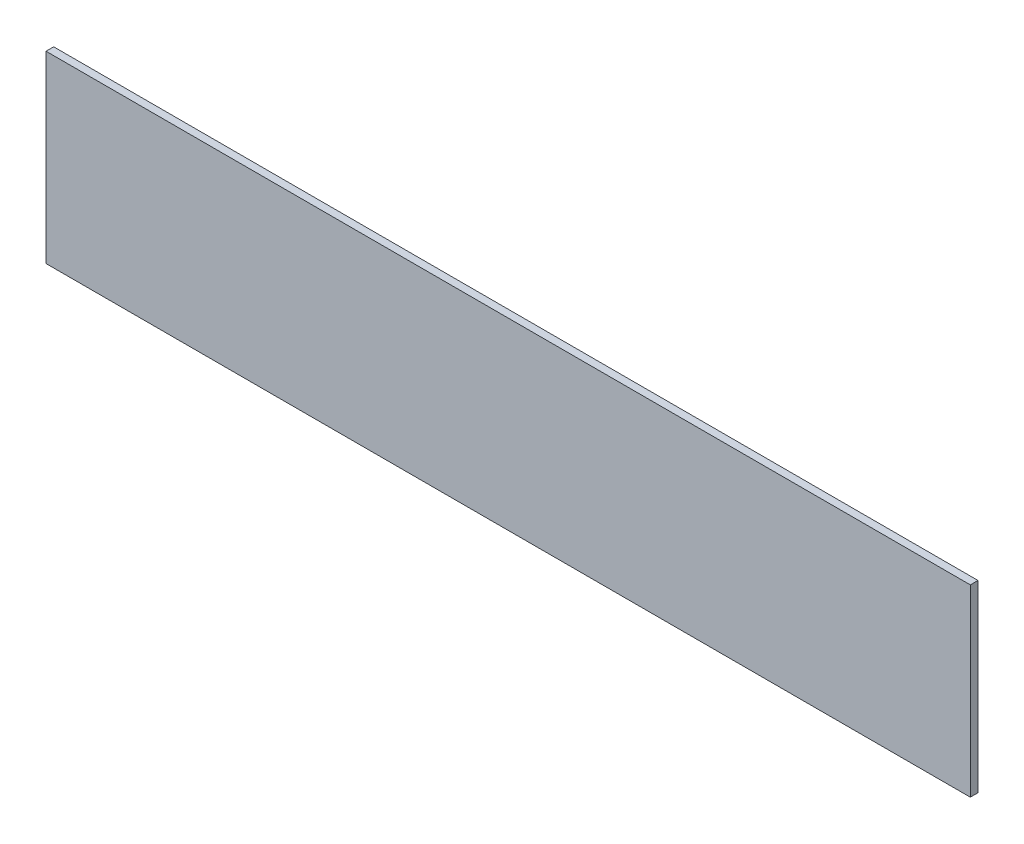
ISO-10303-21;
HEADER;
FILE_DESCRIPTION(('STEP AP214'),'2;1');
FILE_NAME('part.step','',(''),(''),'','','');
FILE_SCHEMA(('AUTOMOTIVE_DESIGN { 1 0 10303 214 1 1 1 1 }'));
ENDSEC;
DATA;
#1=APPLICATION_CONTEXT('core data for automotive mechanical design processes');
#2=APPLICATION_PROTOCOL_DEFINITION('international standard','automotive_design',2000,#1);
#3=PRODUCT_CONTEXT('',#1,'mechanical');
#4=PRODUCT('Part','Part','',(#3));
#5=PRODUCT_RELATED_PRODUCT_CATEGORY('part','',(#4));
#6=PRODUCT_DEFINITION_FORMATION('','',#4);
#7=PRODUCT_DEFINITION_CONTEXT('part definition',#1,'design');
#8=PRODUCT_DEFINITION('design','',#6,#7);
#9=PRODUCT_DEFINITION_SHAPE('','',#8);
#10=(LENGTH_UNIT() NAMED_UNIT(*) SI_UNIT(.MILLI.,.METRE.));
#11=(NAMED_UNIT(*) PLANE_ANGLE_UNIT() SI_UNIT($,.RADIAN.));
#12=(NAMED_UNIT(*) SI_UNIT($,.STERADIAN.) SOLID_ANGLE_UNIT());
#13=UNCERTAINTY_MEASURE_WITH_UNIT(LENGTH_MEASURE(1.E-05),#10,'distance_accuracy_value','');
#14=(GEOMETRIC_REPRESENTATION_CONTEXT(3) GLOBAL_UNCERTAINTY_ASSIGNED_CONTEXT((#13)) GLOBAL_UNIT_ASSIGNED_CONTEXT((#10,
#11,#12)) REPRESENTATION_CONTEXT('',''));
#15=CARTESIAN_POINT('',(0.,0.,0.));
#16=DIRECTION('',(0.,0.,1.));
#17=DIRECTION('',(1.,0.,0.));
#18=AXIS2_PLACEMENT_3D('',#15,#16,#17);
#19=CARTESIAN_POINT('',(0.,0.,3.175));
#20=DIRECTION('',(1.,0.,0.));
#21=DIRECTION('',(0.,0.,-1.));
#22=AXIS2_PLACEMENT_3D('',#19,#20,#21);
#23=PLANE('',#22);
#24=DIRECTION('',(0.,-1.,0.));
#25=VECTOR('',#24,1.);
#26=CARTESIAN_POINT('',(0.,0.,0.));
#27=LINE('',#26,#25);
#28=CARTESIAN_POINT('',(0.,76.2,0.));
#29=VERTEX_POINT('',#28);
#30=CARTESIAN_POINT('',(0.,0.,0.));
#31=VERTEX_POINT('',#30);
#32=EDGE_CURVE('E104',#29,#31,#27,.T.);
#33=ORIENTED_EDGE('',*,*,#32,.T.);
#34=DIRECTION('',(0.,0.,-1.));
#35=VECTOR('',#34,1.);
#36=CARTESIAN_POINT('',(0.,0.,3.175));
#37=LINE('',#36,#35);
#38=CARTESIAN_POINT('',(0.,0.,3.175));
#39=VERTEX_POINT('',#38);
#40=EDGE_CURVE('E11',#39,#31,#37,.T.);
#41=ORIENTED_EDGE('',*,*,#40,.F.);
#42=DIRECTION('',(0.,-1.,0.));
#43=VECTOR('',#42,1.);
#44=CARTESIAN_POINT('',(0.,0.,3.175));
#45=LINE('',#44,#43);
#46=CARTESIAN_POINT('',(0.,76.2,3.175));
#47=VERTEX_POINT('',#46);
#48=EDGE_CURVE('E92',#47,#39,#45,.T.);
#49=ORIENTED_EDGE('',*,*,#48,.F.);
#50=DIRECTION('',(0.,0.,-1.));
#51=VECTOR('',#50,1.);
#52=CARTESIAN_POINT('',(0.,76.2,3.175));
#53=LINE('',#52,#51);
#54=EDGE_CURVE('E100',#47,#29,#53,.T.);
#55=ORIENTED_EDGE('',*,*,#54,.T.);
#56=EDGE_LOOP('',(#33,#41,#49,#55));
#57=FACE_BOUND('',#56,.T.);
#58=ADVANCED_FACE('F41',(#57),#23,.F.);
#59=CARTESIAN_POINT('',(0.,0.,3.175));
#60=DIRECTION('',(0.,1.,0.));
#61=DIRECTION('',(0.,0.,1.));
#62=AXIS2_PLACEMENT_3D('',#59,#60,#61);
#63=PLANE('',#62);
#64=DIRECTION('',(1.,0.,0.));
#65=VECTOR('',#64,1.);
#66=CARTESIAN_POINT('',(0.,0.,0.));
#67=LINE('',#66,#65);
#68=CARTESIAN_POINT('',(383.0066,0.,0.));
#69=VERTEX_POINT('',#68);
#70=EDGE_CURVE('E96',#31,#69,#67,.T.);
#71=ORIENTED_EDGE('',*,*,#70,.T.);
#72=DIRECTION('',(0.,0.,-1.));
#73=VECTOR('',#72,1.);
#74=CARTESIAN_POINT('',(383.0066,0.,3.175));
#75=LINE('',#74,#73);
#76=CARTESIAN_POINT('',(383.0066,0.,3.175));
#77=VERTEX_POINT('',#76);
#78=EDGE_CURVE('E49',#77,#69,#75,.T.);
#79=ORIENTED_EDGE('',*,*,#78,.F.);
#80=DIRECTION('',(1.,0.,0.));
#81=VECTOR('',#80,1.);
#82=CARTESIAN_POINT('',(0.,0.,3.175));
#83=LINE('',#82,#81);
#84=EDGE_CURVE('E87',#39,#77,#83,.T.);
#85=ORIENTED_EDGE('',*,*,#84,.F.);
#86=ORIENTED_EDGE('',*,*,#40,.T.);
#87=EDGE_LOOP('',(#71,#79,#85,#86));
#88=FACE_BOUND('',#87,.T.);
#89=ADVANCED_FACE('F95',(#88),#63,.F.);
#90=CARTESIAN_POINT('',(383.0066,0.,3.175));
#91=DIRECTION('',(-1.,0.,0.));
#92=DIRECTION('',(0.,0.,1.));
#93=AXIS2_PLACEMENT_3D('',#90,#91,#92);
#94=PLANE('',#93);
#95=DIRECTION('',(0.,1.,0.));
#96=VECTOR('',#95,1.);
#97=CARTESIAN_POINT('',(383.0066,0.,0.));
#98=LINE('',#97,#96);
#99=CARTESIAN_POINT('',(383.0066,76.2,0.));
#100=VERTEX_POINT('',#99);
#101=EDGE_CURVE('E74',#69,#100,#98,.T.);
#102=ORIENTED_EDGE('',*,*,#101,.T.);
#103=DIRECTION('',(0.,0.,-1.));
#104=VECTOR('',#103,1.);
#105=CARTESIAN_POINT('',(383.0066,76.2,3.175));
#106=LINE('',#105,#104);
#107=CARTESIAN_POINT('',(383.0066,76.2,3.175));
#108=VERTEX_POINT('',#107);
#109=EDGE_CURVE('E97',#108,#100,#106,.T.);
#110=ORIENTED_EDGE('',*,*,#109,.F.);
#111=DIRECTION('',(0.,1.,0.));
#112=VECTOR('',#111,1.);
#113=CARTESIAN_POINT('',(383.0066,0.,3.175));
#114=LINE('',#113,#112);
#115=EDGE_CURVE('E90',#77,#108,#114,.T.);
#116=ORIENTED_EDGE('',*,*,#115,.F.);
#117=ORIENTED_EDGE('',*,*,#78,.T.);
#118=EDGE_LOOP('',(#102,#110,#116,#117));
#119=FACE_BOUND('',#118,.T.);
#120=ADVANCED_FACE('F98',(#119),#94,.F.);
#121=CARTESIAN_POINT('',(0.,76.2,3.175));
#122=DIRECTION('',(0.,-1.,0.));
#123=DIRECTION('',(0.,0.,-1.));
#124=AXIS2_PLACEMENT_3D('',#121,#122,#123);
#125=PLANE('',#124);
#126=DIRECTION('',(-1.,0.,0.));
#127=VECTOR('',#126,1.);
#128=CARTESIAN_POINT('',(0.,76.2,0.));
#129=LINE('',#128,#127);
#130=EDGE_CURVE('E80',#100,#29,#129,.T.);
#131=ORIENTED_EDGE('',*,*,#130,.T.);
#132=ORIENTED_EDGE('',*,*,#54,.F.);
#133=DIRECTION('',(-1.,0.,0.));
#134=VECTOR('',#133,1.);
#135=CARTESIAN_POINT('',(0.,76.2,3.175));
#136=LINE('',#135,#134);
#137=EDGE_CURVE('E57',#108,#47,#136,.T.);
#138=ORIENTED_EDGE('',*,*,#137,.F.);
#139=ORIENTED_EDGE('',*,*,#109,.T.);
#140=EDGE_LOOP('',(#131,#132,#138,#139));
#141=FACE_BOUND('',#140,.T.);
#142=ADVANCED_FACE('F111',(#141),#125,.F.);
#143=CARTESIAN_POINT('',(0.,0.,3.175));
#144=DIRECTION('',(0.,0.,-1.));
#145=DIRECTION('',(-1.,0.,0.));
#146=AXIS2_PLACEMENT_3D('',#143,#144,#145);
#147=PLANE('',#146);
#148=ORIENTED_EDGE('',*,*,#48,.T.);
#149=ORIENTED_EDGE('',*,*,#84,.T.);
#150=ORIENTED_EDGE('',*,*,#115,.T.);
#151=ORIENTED_EDGE('',*,*,#137,.T.);
#152=EDGE_LOOP('',(#148,#149,#150,#151));
#153=FACE_BOUND('',#152,.T.);
#154=ADVANCED_FACE('F88',(#153),#147,.F.);
#155=CARTESIAN_POINT('',(0.,0.,0.));
#156=DIRECTION('',(0.,0.,-1.));
#157=DIRECTION('',(-1.,0.,0.));
#158=AXIS2_PLACEMENT_3D('',#155,#156,#157);
#159=PLANE('',#158);
#160=ORIENTED_EDGE('',*,*,#32,.F.);
#161=ORIENTED_EDGE('',*,*,#130,.F.);
#162=ORIENTED_EDGE('',*,*,#101,.F.);
#163=ORIENTED_EDGE('',*,*,#70,.F.);
#164=EDGE_LOOP('',(#160,#161,#162,#163));
#165=FACE_BOUND('',#164,.T.);
#166=ADVANCED_FACE('F114',(#165),#159,.T.);
#167=CLOSED_SHELL('',(#58,#89,#120,#142,#154,#166));
#168=MANIFOLD_SOLID_BREP('B2',#167);
#169=ADVANCED_BREP_SHAPE_REPRESENTATION('',(#18,#168),#14);
#170=SHAPE_DEFINITION_REPRESENTATION(#9,#169);
ENDSEC;
END-ISO-10303-21;
